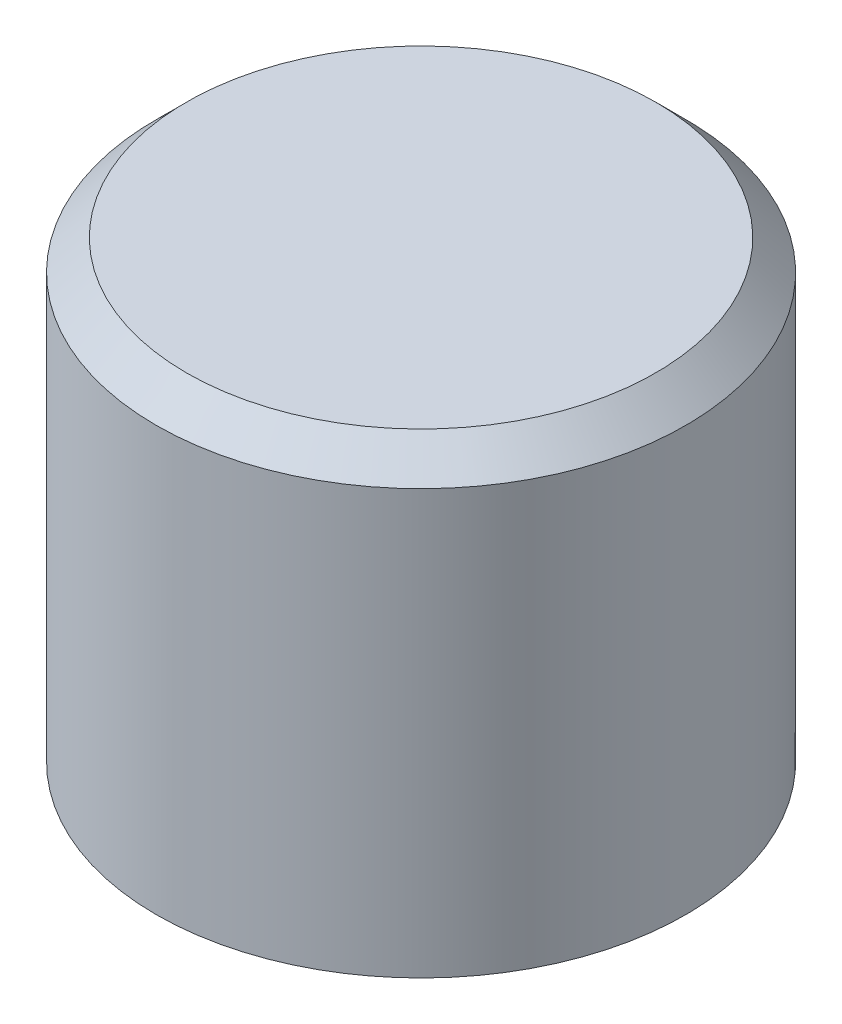
ISO-10303-21;
HEADER;
FILE_DESCRIPTION(('STEP AP214'),'2;1');
FILE_NAME('part.step','',(''),(''),'','','');
FILE_SCHEMA(('AUTOMOTIVE_DESIGN { 1 0 10303 214 1 1 1 1 }'));
ENDSEC;
DATA;
#1=APPLICATION_CONTEXT('core data for automotive mechanical design processes');
#2=APPLICATION_PROTOCOL_DEFINITION('international standard','automotive_design',2000,#1);
#3=PRODUCT_CONTEXT('',#1,'mechanical');
#4=PRODUCT('Part','Part','',(#3));
#5=PRODUCT_RELATED_PRODUCT_CATEGORY('part','',(#4));
#6=PRODUCT_DEFINITION_FORMATION('','',#4);
#7=PRODUCT_DEFINITION_CONTEXT('part definition',#1,'design');
#8=PRODUCT_DEFINITION('design','',#6,#7);
#9=PRODUCT_DEFINITION_SHAPE('','',#8);
#10=(LENGTH_UNIT() NAMED_UNIT(*) SI_UNIT(.MILLI.,.METRE.));
#11=(NAMED_UNIT(*) PLANE_ANGLE_UNIT() SI_UNIT($,.RADIAN.));
#12=(NAMED_UNIT(*) SI_UNIT($,.STERADIAN.) SOLID_ANGLE_UNIT());
#13=UNCERTAINTY_MEASURE_WITH_UNIT(LENGTH_MEASURE(1.E-05),#10,'distance_accuracy_value','');
#14=(GEOMETRIC_REPRESENTATION_CONTEXT(3) GLOBAL_UNCERTAINTY_ASSIGNED_CONTEXT((#13)) GLOBAL_UNIT_ASSIGNED_CONTEXT((#10,
#11,#12)) REPRESENTATION_CONTEXT('',''));
#15=CARTESIAN_POINT('',(0.,0.,0.));
#16=DIRECTION('',(0.,0.,1.));
#17=DIRECTION('',(1.,0.,0.));
#18=AXIS2_PLACEMENT_3D('',#15,#16,#17);
#19=CARTESIAN_POINT('',(0.,15.,0.));
#20=DIRECTION('',(0.,-1.,0.));
#21=DIRECTION('',(0.,0.,-1.));
#22=AXIS2_PLACEMENT_3D('',#19,#20,#21);
#23=CYLINDRICAL_SURFACE('',#22,8.75);
#24=CARTESIAN_POINT('',(0.,14.,0.));
#25=DIRECTION('',(0.,1.,0.));
#26=DIRECTION('',(0.,0.,1.));
#27=AXIS2_PLACEMENT_3D('',#24,#25,#26);
#28=CIRCLE('',#27,8.75);
#29=CARTESIAN_POINT('',(0.,14.,8.75));
#30=VERTEX_POINT('',#29);
#31=EDGE_CURVE('E120',#30,#30,#28,.F.);
#32=ORIENTED_EDGE('',*,*,#31,.T.);
#33=EDGE_LOOP('',(#32));
#34=FACE_BOUND('',#33,.T.);
#35=CARTESIAN_POINT('',(0.,0.,0.));
#36=DIRECTION('',(0.,1.,0.));
#37=DIRECTION('',(0.,0.,1.));
#38=AXIS2_PLACEMENT_3D('',#35,#36,#37);
#39=CIRCLE('',#38,8.75);
#40=CARTESIAN_POINT('',(0.,0.,8.75));
#41=VERTEX_POINT('',#40);
#42=EDGE_CURVE('E112',#41,#41,#39,.T.);
#43=ORIENTED_EDGE('',*,*,#42,.T.);
#44=EDGE_LOOP('',(#43));
#45=FACE_BOUND('',#44,.T.);
#46=ADVANCED_FACE('F45',(#34,#45),#23,.T.);
#47=CARTESIAN_POINT('',(0.,15.,0.));
#48=DIRECTION('',(0.,1.,0.));
#49=DIRECTION('',(0.,0.,1.));
#50=AXIS2_PLACEMENT_3D('',#47,#48,#49);
#51=PLANE('',#50);
#52=CARTESIAN_POINT('',(0.,15.,0.));
#53=DIRECTION('',(0.,1.,0.));
#54=DIRECTION('',(0.,0.,1.));
#55=AXIS2_PLACEMENT_3D('',#52,#53,#54);
#56=CIRCLE('',#55,7.75);
#57=CARTESIAN_POINT('',(0.,15.,7.75));
#58=VERTEX_POINT('',#57);
#59=EDGE_CURVE('E117',#58,#58,#56,.T.);
#60=ORIENTED_EDGE('',*,*,#59,.T.);
#61=EDGE_LOOP('',(#60));
#62=FACE_BOUND('',#61,.T.);
#63=ADVANCED_FACE('F147',(#62),#51,.T.);
#64=CARTESIAN_POINT('',(0.,0.,0.));
#65=DIRECTION('',(0.,1.,0.));
#66=DIRECTION('',(0.,0.,1.));
#67=AXIS2_PLACEMENT_3D('',#64,#65,#66);
#68=PLANE('',#67);
#69=CARTESIAN_POINT('',(0.,0.,0.));
#70=DIRECTION('',(0.,-1.,0.));
#71=DIRECTION('',(0.,0.,-1.));
#72=AXIS2_PLACEMENT_3D('',#69,#70,#71);
#73=CIRCLE('',#72,7.);
#74=CARTESIAN_POINT('',(0.,0.,-7.));
#75=VERTEX_POINT('',#74);
#76=EDGE_CURVE('E108',#75,#75,#73,.T.);
#77=ORIENTED_EDGE('',*,*,#76,.F.);
#78=EDGE_LOOP('',(#77));
#79=FACE_BOUND('',#78,.T.);
#80=ORIENTED_EDGE('',*,*,#42,.F.);
#81=EDGE_LOOP('',(#80));
#82=FACE_BOUND('',#81,.T.);
#83=ADVANCED_FACE('F149',(#79,#82),#68,.F.);
#84=CARTESIAN_POINT('',(0.,8.,0.));
#85=DIRECTION('',(0.,-1.,0.));
#86=DIRECTION('',(0.,0.,-1.));
#87=AXIS2_PLACEMENT_3D('',#84,#85,#86);
#88=CYLINDRICAL_SURFACE('',#87,7.);
#89=CARTESIAN_POINT('',(0.,8.,0.));
#90=DIRECTION('',(0.,-1.,0.));
#91=DIRECTION('',(0.,0.,-1.));
#92=AXIS2_PLACEMENT_3D('',#89,#90,#91);
#93=CIRCLE('',#92,7.);
#94=CARTESIAN_POINT('',(0.,8.,-7.));
#95=VERTEX_POINT('',#94);
#96=EDGE_CURVE('E109',#95,#95,#93,.T.);
#97=ORIENTED_EDGE('',*,*,#96,.F.);
#98=EDGE_LOOP('',(#97));
#99=FACE_BOUND('',#98,.T.);
#100=ORIENTED_EDGE('',*,*,#76,.T.);
#101=EDGE_LOOP('',(#100));
#102=FACE_BOUND('',#101,.T.);
#103=ADVANCED_FACE('F152',(#99,#102),#88,.F.);
#104=CARTESIAN_POINT('',(0.,8.,0.));
#105=DIRECTION('',(0.,-1.,0.));
#106=DIRECTION('',(0.,0.,-1.));
#107=AXIS2_PLACEMENT_3D('',#104,#105,#106);
#108=PLANE('',#107);
#109=DIRECTION('',(1.,0.,0.));
#110=VECTOR('',#109,1.);
#111=CARTESIAN_POINT('',(2.75,8.,2.73205080756887));
#112=LINE('',#111,#110);
#113=CARTESIAN_POINT('',(-3.25551814383859,8.,2.73205080756887));
#114=VERTEX_POINT('',#113);
#115=CARTESIAN_POINT('',(3.25551814383859,8.,2.73205080756887));
#116=VERTEX_POINT('',#115);
#117=EDGE_CURVE('E67',#114,#116,#112,.T.);
#118=ORIENTED_EDGE('',*,*,#117,.T.);
#119=CARTESIAN_POINT('',(0.,8.,0.));
#120=DIRECTION('',(0.,-1.,0.));
#121=DIRECTION('',(0.,0.,-1.));
#122=AXIS2_PLACEMENT_3D('',#119,#120,#121);
#123=CIRCLE('',#122,4.25);
#124=EDGE_CURVE('E60',#116,#114,#123,.F.);
#125=ORIENTED_EDGE('',*,*,#124,.T.);
#126=EDGE_LOOP('',(#118,#125));
#127=FACE_BOUND('',#126,.T.);
#128=ORIENTED_EDGE('',*,*,#96,.T.);
#129=EDGE_LOOP('',(#128));
#130=FACE_BOUND('',#129,.T.);
#131=ADVANCED_FACE('F159',(#127,#130),#108,.T.);
#132=CARTESIAN_POINT('',(0.,13.5,0.));
#133=DIRECTION('',(0.,1.,0.));
#134=DIRECTION('',(0.,0.,1.));
#135=AXIS2_PLACEMENT_3D('',#132,#133,#134);
#136=PLANE('',#135);
#137=CARTESIAN_POINT('',(0.,13.5,0.));
#138=DIRECTION('',(0.,1.,0.));
#139=DIRECTION('',(0.,0.,1.));
#140=AXIS2_PLACEMENT_3D('',#137,#138,#139);
#141=CIRCLE('',#140,3.25);
#142=CARTESIAN_POINT('',(-2.75,13.5,1.73205080756888));
#143=VERTEX_POINT('',#142);
#144=CARTESIAN_POINT('',(2.75,13.5,1.73205080756888));
#145=VERTEX_POINT('',#144);
#146=EDGE_CURVE('E88',#143,#145,#141,.F.);
#147=ORIENTED_EDGE('',*,*,#146,.T.);
#148=DIRECTION('',(-1.,0.,0.));
#149=VECTOR('',#148,1.);
#150=CARTESIAN_POINT('',(-2.75,13.5,1.73205080756888));
#151=LINE('',#150,#149);
#152=EDGE_CURVE('E100',#145,#143,#151,.T.);
#153=ORIENTED_EDGE('',*,*,#152,.T.);
#154=EDGE_LOOP('',(#147,#153));
#155=FACE_BOUND('',#154,.T.);
#156=ADVANCED_FACE('F103',(#155),#136,.F.);
#157=CARTESIAN_POINT('',(-2.75,23.1896782750727,1.73205080756888));
#158=DIRECTION('',(0.,0.,1.));
#159=DIRECTION('',(1.,0.,0.));
#160=AXIS2_PLACEMENT_3D('',#157,#158,#159);
#161=PLANE('',#160);
#162=DIRECTION('',(0.,-1.,0.));
#163=VECTOR('',#162,1.);
#164=CARTESIAN_POINT('',(2.75,23.1896782750727,1.73205080756888));
#165=LINE('',#164,#163);
#166=CARTESIAN_POINT('',(2.75,9.,1.73205080756888));
#167=VERTEX_POINT('',#166);
#168=EDGE_CURVE('E94',#145,#167,#165,.T.);
#169=ORIENTED_EDGE('',*,*,#168,.T.);
#170=DIRECTION('',(-1.,0.,0.));
#171=VECTOR('',#170,1.);
#172=CARTESIAN_POINT('',(-2.75,8.99999999999999,1.73205080756888));
#173=LINE('',#172,#171);
#174=CARTESIAN_POINT('',(-2.75,9.,1.73205080756888));
#175=VERTEX_POINT('',#174);
#176=EDGE_CURVE('E12',#167,#175,#173,.T.);
#177=ORIENTED_EDGE('',*,*,#176,.T.);
#178=DIRECTION('',(0.,-1.,0.));
#179=VECTOR('',#178,1.);
#180=CARTESIAN_POINT('',(-2.75,23.1896782750727,1.73205080756888));
#181=LINE('',#180,#179);
#182=EDGE_CURVE('E92',#143,#175,#181,.T.);
#183=ORIENTED_EDGE('',*,*,#182,.F.);
#184=ORIENTED_EDGE('',*,*,#152,.F.);
#185=EDGE_LOOP('',(#169,#177,#183,#184));
#186=FACE_BOUND('',#185,.T.);
#187=ADVANCED_FACE('F99',(#186),#161,.F.);
#188=CARTESIAN_POINT('',(0.,23.1896782750727,0.));
#189=DIRECTION('',(0.,-1.,0.));
#190=DIRECTION('',(0.,0.,-1.));
#191=AXIS2_PLACEMENT_3D('',#188,#189,#190);
#192=CYLINDRICAL_SURFACE('',#191,3.25);
#193=ORIENTED_EDGE('',*,*,#182,.T.);
#194=CARTESIAN_POINT('',(0.,8.99999999999999,0.));
#195=DIRECTION('',(0.,-1.,0.));
#196=DIRECTION('',(0.,0.,-1.));
#197=AXIS2_PLACEMENT_3D('',#194,#195,#196);
#198=CIRCLE('',#197,3.25);
#199=EDGE_CURVE('E123',#175,#167,#198,.T.);
#200=ORIENTED_EDGE('',*,*,#199,.T.);
#201=ORIENTED_EDGE('',*,*,#168,.F.);
#202=ORIENTED_EDGE('',*,*,#146,.F.);
#203=EDGE_LOOP('',(#193,#200,#201,#202));
#204=FACE_BOUND('',#203,.T.);
#205=ADVANCED_FACE('F90',(#204),#192,.F.);
#206=CARTESIAN_POINT('',(0.,15.,0.));
#207=DIRECTION('',(0.,-1.,0.));
#208=DIRECTION('',(0.,0.,-1.));
#209=AXIS2_PLACEMENT_3D('',#206,#207,#208);
#210=CONICAL_SURFACE('',#209,7.75,0.785398163397447);
#211=ORIENTED_EDGE('',*,*,#31,.F.);
#212=EDGE_LOOP('',(#211));
#213=FACE_BOUND('',#212,.T.);
#214=ORIENTED_EDGE('',*,*,#59,.F.);
#215=EDGE_LOOP('',(#214));
#216=FACE_BOUND('',#215,.T.);
#217=ADVANCED_FACE('F138',(#213,#216),#210,.T.);
#218=CARTESIAN_POINT('',(-2.75,8.99999999999999,1.73205080756888));
#219=DIRECTION('',(0.,-0.707106781186548,-0.707106781186547));
#220=DIRECTION('',(1.,0.,0.));
#221=AXIS2_PLACEMENT_3D('',#218,#219,#220);
#222=PLANE('',#221);
#223=CARTESIAN_POINT('',(2.75,9.,1.73205080756888));
#224=CARTESIAN_POINT('',(2.79551008035985,8.9175369169019,1.81451389066697));
#225=CARTESIAN_POINT('',(2.84005238258389,8.83480942408598,1.89724138348289));
#226=CARTESIAN_POINT('',(2.92738367225981,8.66890936543365,2.06314144213522));
#227=CARTESIAN_POINT('',(2.97017297023664,8.58573688139937,2.1463139261695));
#228=CARTESIAN_POINT('',(3.05419414224797,8.41900597565176,2.31304483191712));
#229=CARTESIAN_POINT('',(3.095426105444,8.33544757634143,2.39660323122745));
#230=CARTESIAN_POINT('',(3.17648870206807,8.16797477133818,2.56407603623069));
#231=CARTESIAN_POINT('',(3.21631908517993,8.08406030502197,2.6479905025469));
#232=CARTESIAN_POINT('',(3.25551814383859,8.,2.73205080756887));
#233=B_SPLINE_CURVE_WITH_KNOTS('',3,(#223,#224,#225,#226,#227,#228,#229,#230,#231,#232),
.UNSPECIFIED.,.F.,.F.,(4,2,2,2,4),(0.,0.375548125368848,0.751029436416137,1.12648921747988,
1.50201571718611),.UNSPECIFIED.);
#234=EDGE_CURVE('E105',#116,#167,#233,.F.);
#235=ORIENTED_EDGE('',*,*,#234,.F.);
#236=ORIENTED_EDGE('',*,*,#117,.F.);
#237=CARTESIAN_POINT('',(-3.25551814383859,8.,2.73205080756887));
#238=CARTESIAN_POINT('',(-3.21631908517993,8.08406030502197,2.6479905025469));
#239=CARTESIAN_POINT('',(-3.17648870206807,8.16797477133818,2.56407603623069));
#240=CARTESIAN_POINT('',(-3.095426105444,8.33544757634142,2.39660323122745));
#241=CARTESIAN_POINT('',(-3.05419414224797,8.41900597565175,2.31304483191712));
#242=CARTESIAN_POINT('',(-2.97017297023664,8.58573688139937,2.1463139261695));
#243=CARTESIAN_POINT('',(-2.92738367225981,8.66890936543365,2.06314144213522));
#244=CARTESIAN_POINT('',(-2.84005238258389,8.83480942408598,1.89724138348289));
#245=CARTESIAN_POINT('',(-2.79551008035985,8.9175369169019,1.81451389066697));
#246=CARTESIAN_POINT('',(-2.75,9.,1.73205080756888));
#247=B_SPLINE_CURVE_WITH_KNOTS('',3,(#237,#238,#239,#240,#241,#242,#243,#244,#245,#246),
.UNSPECIFIED.,.F.,.F.,(4,2,2,2,4),(0.,0.375526499706233,0.750986280769974,1.12646759181726,
1.50201571718611),.UNSPECIFIED.);
#248=EDGE_CURVE('E51',#175,#114,#247,.F.);
#249=ORIENTED_EDGE('',*,*,#248,.F.);
#250=ORIENTED_EDGE('',*,*,#176,.F.);
#251=EDGE_LOOP('',(#235,#236,#249,#250));
#252=FACE_BOUND('',#251,.T.);
#253=ADVANCED_FACE('F48',(#252),#222,.T.);
#254=CARTESIAN_POINT('',(0.,8.99999999999999,0.));
#255=DIRECTION('',(0.,-1.,0.));
#256=DIRECTION('',(0.,0.,-1.));
#257=AXIS2_PLACEMENT_3D('',#254,#255,#256);
#258=CONICAL_SURFACE('',#257,3.25,0.78539816339745);
#259=ORIENTED_EDGE('',*,*,#248,.T.);
#260=ORIENTED_EDGE('',*,*,#124,.F.);
#261=ORIENTED_EDGE('',*,*,#234,.T.);
#262=ORIENTED_EDGE('',*,*,#199,.F.);
#263=EDGE_LOOP('',(#259,#260,#261,#262));
#264=FACE_BOUND('',#263,.T.);
#265=ADVANCED_FACE('F131',(#264),#258,.F.);
#266=CLOSED_SHELL('',(#46,#63,#83,#103,#131,#156,#187,#205,#217,#253,#265));
#267=MANIFOLD_SOLID_BREP('B2',#266);
#268=ADVANCED_BREP_SHAPE_REPRESENTATION('',(#18,#267),#14);
#269=SHAPE_DEFINITION_REPRESENTATION(#9,#268);
ENDSEC;
END-ISO-10303-21;
